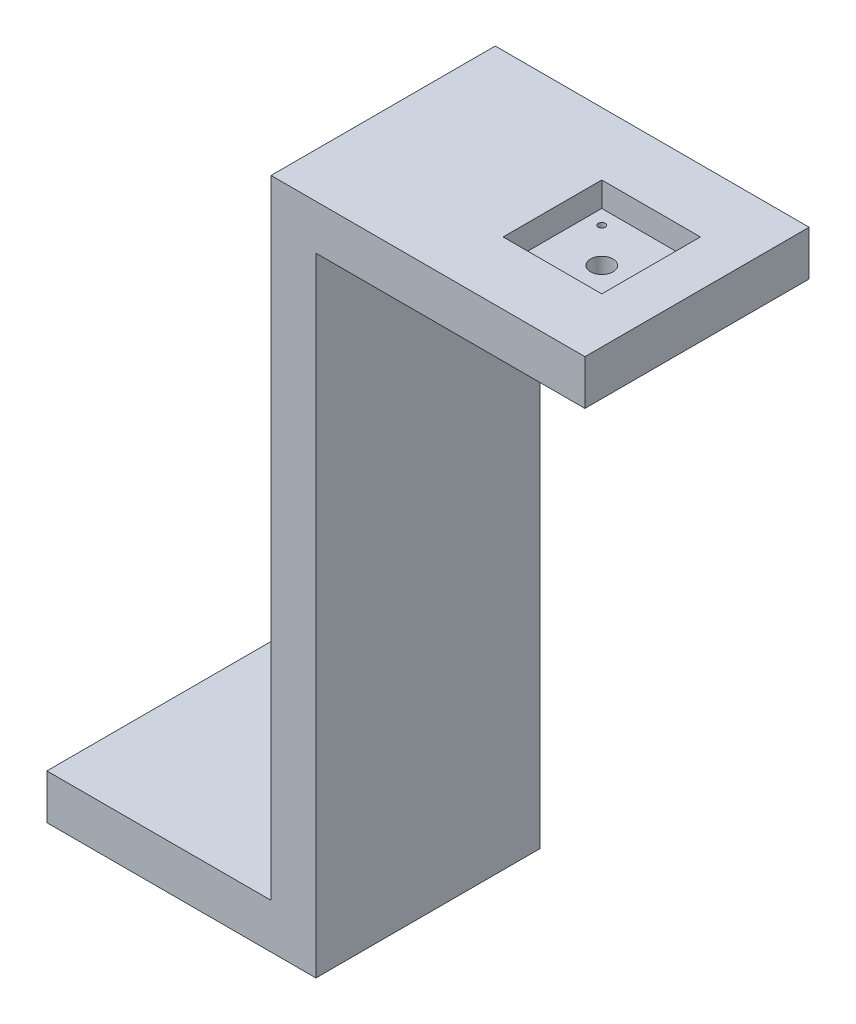
ISO-10303-21;
HEADER;
FILE_DESCRIPTION(('STEP AP214'),'2;1');
FILE_NAME('part.step','',(''),(''),'','','');
FILE_SCHEMA(('AUTOMOTIVE_DESIGN { 1 0 10303 214 1 1 1 1 }'));
ENDSEC;
DATA;
#1=APPLICATION_CONTEXT('core data for automotive mechanical design processes');
#2=APPLICATION_PROTOCOL_DEFINITION('international standard','automotive_design',2000,#1);
#3=PRODUCT_CONTEXT('',#1,'mechanical');
#4=PRODUCT('Part','Part','',(#3));
#5=PRODUCT_RELATED_PRODUCT_CATEGORY('part','',(#4));
#6=PRODUCT_DEFINITION_FORMATION('','',#4);
#7=PRODUCT_DEFINITION_CONTEXT('part definition',#1,'design');
#8=PRODUCT_DEFINITION('design','',#6,#7);
#9=PRODUCT_DEFINITION_SHAPE('','',#8);
#10=(LENGTH_UNIT() NAMED_UNIT(*) SI_UNIT(.MILLI.,.METRE.));
#11=(NAMED_UNIT(*) PLANE_ANGLE_UNIT() SI_UNIT($,.RADIAN.));
#12=(NAMED_UNIT(*) SI_UNIT($,.STERADIAN.) SOLID_ANGLE_UNIT());
#13=UNCERTAINTY_MEASURE_WITH_UNIT(LENGTH_MEASURE(1.E-05),#10,'distance_accuracy_value','');
#14=(GEOMETRIC_REPRESENTATION_CONTEXT(3) GLOBAL_UNCERTAINTY_ASSIGNED_CONTEXT((#13)) GLOBAL_UNIT_ASSIGNED_CONTEXT((#10,
#11,#12)) REPRESENTATION_CONTEXT('',''));
#15=CARTESIAN_POINT('',(0.,0.,0.));
#16=DIRECTION('',(0.,0.,1.));
#17=DIRECTION('',(1.,0.,0.));
#18=AXIS2_PLACEMENT_3D('',#15,#16,#17);
#19=CARTESIAN_POINT('',(77.5,200.,50.));
#20=DIRECTION('',(0.,1.,0.));
#21=DIRECTION('',(0.,0.,1.));
#22=AXIS2_PLACEMENT_3D('',#19,#20,#21);
#23=CYLINDRICAL_SURFACE('',#22,4.99999999999999);
#24=CARTESIAN_POINT('',(77.5,280.,50.));
#25=DIRECTION('',(0.,1.,0.));
#26=DIRECTION('',(0.,0.,1.));
#27=AXIS2_PLACEMENT_3D('',#24,#25,#26);
#28=CIRCLE('',#27,4.99999999999999);
#29=CARTESIAN_POINT('',(77.5,280.,55.));
#30=VERTEX_POINT('',#29);
#31=EDGE_CURVE('E159',#30,#30,#28,.T.);
#32=ORIENTED_EDGE('',*,*,#31,.F.);
#33=EDGE_LOOP('',(#32));
#34=FACE_BOUND('',#33,.T.);
#35=CARTESIAN_POINT('',(77.5,289.,50.));
#36=DIRECTION('',(0.,1.,0.));
#37=DIRECTION('',(0.,0.,1.));
#38=AXIS2_PLACEMENT_3D('',#35,#36,#37);
#39=CIRCLE('',#38,4.99999999999999);
#40=CARTESIAN_POINT('',(77.5,289.,55.));
#41=VERTEX_POINT('',#40);
#42=EDGE_CURVE('E43',#41,#41,#39,.F.);
#43=ORIENTED_EDGE('',*,*,#42,.F.);
#44=EDGE_LOOP('',(#43));
#45=FACE_BOUND('',#44,.T.);
#46=ADVANCED_FACE('F39',(#34,#45),#23,.F.);
#47=CARTESIAN_POINT('',(-120.,0.,100.));
#48=DIRECTION('',(0.,1.,0.));
#49=DIRECTION('',(0.,0.,1.));
#50=AXIS2_PLACEMENT_3D('',#47,#48,#49);
#51=PLANE('',#50);
#52=DIRECTION('',(1.,0.,0.));
#53=VECTOR('',#52,1.);
#54=CARTESIAN_POINT('',(-120.,0.,0.));
#55=LINE('',#54,#53);
#56=CARTESIAN_POINT('',(-120.,0.,0.));
#57=VERTEX_POINT('',#56);
#58=CARTESIAN_POINT('',(0.,0.,0.));
#59=VERTEX_POINT('',#58);
#60=EDGE_CURVE('E154',#57,#59,#55,.T.);
#61=ORIENTED_EDGE('',*,*,#60,.T.);
#62=DIRECTION('',(0.,0.,-1.));
#63=VECTOR('',#62,1.);
#64=CARTESIAN_POINT('',(0.,0.,100.));
#65=LINE('',#64,#63);
#66=CARTESIAN_POINT('',(0.,0.,100.));
#67=VERTEX_POINT('',#66);
#68=EDGE_CURVE('E11',#67,#59,#65,.T.);
#69=ORIENTED_EDGE('',*,*,#68,.F.);
#70=DIRECTION('',(1.,0.,0.));
#71=VECTOR('',#70,1.);
#72=CARTESIAN_POINT('',(-120.,0.,100.));
#73=LINE('',#72,#71);
#74=CARTESIAN_POINT('',(-120.,0.,100.));
#75=VERTEX_POINT('',#74);
#76=EDGE_CURVE('E178',#75,#67,#73,.T.);
#77=ORIENTED_EDGE('',*,*,#76,.F.);
#78=DIRECTION('',(0.,0.,-1.));
#79=VECTOR('',#78,1.);
#80=CARTESIAN_POINT('',(-120.,0.,100.));
#81=LINE('',#80,#79);
#82=EDGE_CURVE('E150',#75,#57,#81,.T.);
#83=ORIENTED_EDGE('',*,*,#82,.T.);
#84=EDGE_LOOP('',(#61,#69,#77,#83));
#85=FACE_BOUND('',#84,.T.);
#86=ADVANCED_FACE('F41',(#85),#51,.F.);
#87=CARTESIAN_POINT('',(0.,0.,100.));
#88=DIRECTION('',(-1.,0.,0.));
#89=DIRECTION('',(0.,0.,1.));
#90=AXIS2_PLACEMENT_3D('',#87,#88,#89);
#91=PLANE('',#90);
#92=DIRECTION('',(0.,1.,0.));
#93=VECTOR('',#92,1.);
#94=CARTESIAN_POINT('',(0.,0.,0.));
#95=LINE('',#94,#93);
#96=CARTESIAN_POINT('',(0.,280.,0.));
#97=VERTEX_POINT('',#96);
#98=EDGE_CURVE('E158',#59,#97,#95,.T.);
#99=ORIENTED_EDGE('',*,*,#98,.T.);
#100=DIRECTION('',(0.,0.,-1.));
#101=VECTOR('',#100,1.);
#102=CARTESIAN_POINT('',(0.,280.,100.));
#103=LINE('',#102,#101);
#104=CARTESIAN_POINT('',(0.,280.,100.));
#105=VERTEX_POINT('',#104);
#106=EDGE_CURVE('E49',#105,#97,#103,.T.);
#107=ORIENTED_EDGE('',*,*,#106,.F.);
#108=DIRECTION('',(0.,1.,0.));
#109=VECTOR('',#108,1.);
#110=CARTESIAN_POINT('',(0.,0.,100.));
#111=LINE('',#110,#109);
#112=EDGE_CURVE('E106',#67,#105,#111,.T.);
#113=ORIENTED_EDGE('',*,*,#112,.F.);
#114=ORIENTED_EDGE('',*,*,#68,.T.);
#115=EDGE_LOOP('',(#99,#107,#113,#114));
#116=FACE_BOUND('',#115,.T.);
#117=ADVANCED_FACE('F327',(#116),#91,.F.);
#118=CARTESIAN_POINT('',(0.,280.,100.));
#119=DIRECTION('',(0.,1.,0.));
#120=DIRECTION('',(0.,0.,1.));
#121=AXIS2_PLACEMENT_3D('',#118,#119,#120);
#122=PLANE('',#121);
#123=CARTESIAN_POINT('',(62.,280.,65.5));
#124=DIRECTION('',(0.,1.,0.));
#125=DIRECTION('',(0.,0.,1.));
#126=AXIS2_PLACEMENT_3D('',#123,#124,#125);
#127=CIRCLE('',#126,1.55000000000001);
#128=CARTESIAN_POINT('',(62.,280.,67.05));
#129=VERTEX_POINT('',#128);
#130=EDGE_CURVE('E256',#129,#129,#127,.T.);
#131=ORIENTED_EDGE('',*,*,#130,.T.);
#132=EDGE_LOOP('',(#131));
#133=FACE_BOUND('',#132,.T.);
#134=CARTESIAN_POINT('',(62.,280.,34.5));
#135=DIRECTION('',(0.,1.,0.));
#136=DIRECTION('',(0.,0.,1.));
#137=AXIS2_PLACEMENT_3D('',#134,#135,#136);
#138=CIRCLE('',#137,1.55);
#139=CARTESIAN_POINT('',(62.,280.,36.05));
#140=VERTEX_POINT('',#139);
#141=EDGE_CURVE('E274',#140,#140,#138,.T.);
#142=ORIENTED_EDGE('',*,*,#141,.T.);
#143=EDGE_LOOP('',(#142));
#144=FACE_BOUND('',#143,.T.);
#145=CARTESIAN_POINT('',(93.,280.,34.5));
#146=DIRECTION('',(0.,1.,0.));
#147=DIRECTION('',(0.,0.,1.));
#148=AXIS2_PLACEMENT_3D('',#145,#146,#147);
#149=CIRCLE('',#148,1.54999999999999);
#150=CARTESIAN_POINT('',(93.,280.,36.05));
#151=VERTEX_POINT('',#150);
#152=EDGE_CURVE('E278',#151,#151,#149,.T.);
#153=ORIENTED_EDGE('',*,*,#152,.T.);
#154=EDGE_LOOP('',(#153));
#155=FACE_BOUND('',#154,.T.);
#156=CARTESIAN_POINT('',(93.,280.,65.5));
#157=DIRECTION('',(0.,1.,0.));
#158=DIRECTION('',(0.,0.,1.));
#159=AXIS2_PLACEMENT_3D('',#156,#157,#158);
#160=CIRCLE('',#159,1.54999999999999);
#161=CARTESIAN_POINT('',(93.,280.,67.05));
#162=VERTEX_POINT('',#161);
#163=EDGE_CURVE('E282',#162,#162,#160,.T.);
#164=ORIENTED_EDGE('',*,*,#163,.T.);
#165=EDGE_LOOP('',(#164));
#166=FACE_BOUND('',#165,.T.);
#167=ORIENTED_EDGE('',*,*,#31,.T.);
#168=EDGE_LOOP('',(#167));
#169=FACE_BOUND('',#168,.T.);
#170=DIRECTION('',(1.,0.,0.));
#171=VECTOR('',#170,1.);
#172=CARTESIAN_POINT('',(0.,280.,0.));
#173=LINE('',#172,#171);
#174=CARTESIAN_POINT('',(120.,280.,0.));
#175=VERTEX_POINT('',#174);
#176=EDGE_CURVE('E162',#97,#175,#173,.T.);
#177=ORIENTED_EDGE('',*,*,#176,.T.);
#178=DIRECTION('',(0.,0.,-1.));
#179=VECTOR('',#178,1.);
#180=CARTESIAN_POINT('',(120.,280.,100.));
#181=LINE('',#180,#179);
#182=CARTESIAN_POINT('',(120.,280.,100.));
#183=VERTEX_POINT('',#182);
#184=EDGE_CURVE('E189',#183,#175,#181,.T.);
#185=ORIENTED_EDGE('',*,*,#184,.F.);
#186=DIRECTION('',(1.,0.,0.));
#187=VECTOR('',#186,1.);
#188=CARTESIAN_POINT('',(0.,280.,100.));
#189=LINE('',#188,#187);
#190=EDGE_CURVE('E200',#105,#183,#189,.T.);
#191=ORIENTED_EDGE('',*,*,#190,.F.);
#192=ORIENTED_EDGE('',*,*,#106,.T.);
#193=EDGE_LOOP('',(#177,#185,#191,#192));
#194=FACE_BOUND('',#193,.T.);
#195=ADVANCED_FACE('F198',(#133,#144,#155,#166,#169,#194),#122,.F.);
#196=CARTESIAN_POINT('',(120.,280.,100.));
#197=DIRECTION('',(-1.,0.,0.));
#198=DIRECTION('',(0.,0.,1.));
#199=AXIS2_PLACEMENT_3D('',#196,#197,#198);
#200=PLANE('',#199);
#201=DIRECTION('',(0.,1.,0.));
#202=VECTOR('',#201,1.);
#203=CARTESIAN_POINT('',(120.,280.,0.));
#204=LINE('',#203,#202);
#205=CARTESIAN_POINT('',(120.,300.,0.));
#206=VERTEX_POINT('',#205);
#207=EDGE_CURVE('E165',#175,#206,#204,.T.);
#208=ORIENTED_EDGE('',*,*,#207,.T.);
#209=DIRECTION('',(0.,0.,-1.));
#210=VECTOR('',#209,1.);
#211=CARTESIAN_POINT('',(120.,300.,100.));
#212=LINE('',#211,#210);
#213=CARTESIAN_POINT('',(120.,300.,100.));
#214=VERTEX_POINT('',#213);
#215=EDGE_CURVE('E185',#214,#206,#212,.T.);
#216=ORIENTED_EDGE('',*,*,#215,.F.);
#217=DIRECTION('',(0.,1.,0.));
#218=VECTOR('',#217,1.);
#219=CARTESIAN_POINT('',(120.,280.,100.));
#220=LINE('',#219,#218);
#221=EDGE_CURVE('E213',#183,#214,#220,.T.);
#222=ORIENTED_EDGE('',*,*,#221,.F.);
#223=ORIENTED_EDGE('',*,*,#184,.T.);
#224=EDGE_LOOP('',(#208,#216,#222,#223));
#225=FACE_BOUND('',#224,.T.);
#226=ADVANCED_FACE('F208',(#225),#200,.F.);
#227=CARTESIAN_POINT('',(120.,300.,100.));
#228=DIRECTION('',(0.,-1.,0.));
#229=DIRECTION('',(0.,0.,-1.));
#230=AXIS2_PLACEMENT_3D('',#227,#228,#229);
#231=PLANE('',#230);
#232=DIRECTION('',(-1.,0.,0.));
#233=VECTOR('',#232,1.);
#234=CARTESIAN_POINT('',(55.5,300.,28.));
#235=LINE('',#234,#233);
#236=CARTESIAN_POINT('',(99.5,300.,28.));
#237=VERTEX_POINT('',#236);
#238=CARTESIAN_POINT('',(55.5,300.,28.));
#239=VERTEX_POINT('',#238);
#240=EDGE_CURVE('E250',#237,#239,#235,.T.);
#241=ORIENTED_EDGE('',*,*,#240,.F.);
#242=DIRECTION('',(0.,0.,-1.));
#243=VECTOR('',#242,1.);
#244=CARTESIAN_POINT('',(99.5,300.,28.));
#245=LINE('',#244,#243);
#246=CARTESIAN_POINT('',(99.5,300.,72.));
#247=VERTEX_POINT('',#246);
#248=EDGE_CURVE('E56',#247,#237,#245,.T.);
#249=ORIENTED_EDGE('',*,*,#248,.F.);
#250=DIRECTION('',(1.,0.,0.));
#251=VECTOR('',#250,1.);
#252=CARTESIAN_POINT('',(55.5,300.,72.));
#253=LINE('',#252,#251);
#254=CARTESIAN_POINT('',(55.5,300.,72.));
#255=VERTEX_POINT('',#254);
#256=EDGE_CURVE('E241',#255,#247,#253,.T.);
#257=ORIENTED_EDGE('',*,*,#256,.F.);
#258=DIRECTION('',(0.,0.,1.));
#259=VECTOR('',#258,1.);
#260=CARTESIAN_POINT('',(55.5,300.,28.));
#261=LINE('',#260,#259);
#262=EDGE_CURVE('E246',#239,#255,#261,.T.);
#263=ORIENTED_EDGE('',*,*,#262,.F.);
#264=EDGE_LOOP('',(#241,#249,#257,#263));
#265=FACE_BOUND('',#264,.T.);
#266=DIRECTION('',(-1.,0.,0.));
#267=VECTOR('',#266,1.);
#268=CARTESIAN_POINT('',(120.,300.,0.));
#269=LINE('',#268,#267);
#270=CARTESIAN_POINT('',(-20.,300.,0.));
#271=VERTEX_POINT('',#270);
#272=EDGE_CURVE('E168',#206,#271,#269,.T.);
#273=ORIENTED_EDGE('',*,*,#272,.T.);
#274=DIRECTION('',(0.,0.,-1.));
#275=VECTOR('',#274,1.);
#276=CARTESIAN_POINT('',(-20.,300.,100.));
#277=LINE('',#276,#275);
#278=CARTESIAN_POINT('',(-20.,300.,100.));
#279=VERTEX_POINT('',#278);
#280=EDGE_CURVE('E143',#279,#271,#277,.T.);
#281=ORIENTED_EDGE('',*,*,#280,.F.);
#282=DIRECTION('',(-1.,0.,0.));
#283=VECTOR('',#282,1.);
#284=CARTESIAN_POINT('',(120.,300.,100.));
#285=LINE('',#284,#283);
#286=EDGE_CURVE('E129',#214,#279,#285,.T.);
#287=ORIENTED_EDGE('',*,*,#286,.F.);
#288=ORIENTED_EDGE('',*,*,#215,.T.);
#289=EDGE_LOOP('',(#273,#281,#287,#288));
#290=FACE_BOUND('',#289,.T.);
#291=ADVANCED_FACE('F211',(#265,#290),#231,.F.);
#292=CARTESIAN_POINT('',(-20.,300.,100.));
#293=DIRECTION('',(1.,0.,0.));
#294=DIRECTION('',(0.,0.,-1.));
#295=AXIS2_PLACEMENT_3D('',#292,#293,#294);
#296=PLANE('',#295);
#297=DIRECTION('',(0.,-1.,0.));
#298=VECTOR('',#297,1.);
#299=CARTESIAN_POINT('',(-20.,300.,0.));
#300=LINE('',#299,#298);
#301=CARTESIAN_POINT('',(-20.,20.,0.));
#302=VERTEX_POINT('',#301);
#303=EDGE_CURVE('E139',#271,#302,#300,.T.);
#304=ORIENTED_EDGE('',*,*,#303,.T.);
#305=DIRECTION('',(0.,0.,-1.));
#306=VECTOR('',#305,1.);
#307=CARTESIAN_POINT('',(-20.,20.,100.));
#308=LINE('',#307,#306);
#309=CARTESIAN_POINT('',(-20.,20.,100.));
#310=VERTEX_POINT('',#309);
#311=EDGE_CURVE('E136',#310,#302,#308,.T.);
#312=ORIENTED_EDGE('',*,*,#311,.F.);
#313=DIRECTION('',(0.,-1.,0.));
#314=VECTOR('',#313,1.);
#315=CARTESIAN_POINT('',(-20.,300.,100.));
#316=LINE('',#315,#314);
#317=EDGE_CURVE('E122',#279,#310,#316,.T.);
#318=ORIENTED_EDGE('',*,*,#317,.F.);
#319=ORIENTED_EDGE('',*,*,#280,.T.);
#320=EDGE_LOOP('',(#304,#312,#318,#319));
#321=FACE_BOUND('',#320,.T.);
#322=ADVANCED_FACE('F137',(#321),#296,.F.);
#323=CARTESIAN_POINT('',(-20.,20.,100.));
#324=DIRECTION('',(0.,-1.,0.));
#325=DIRECTION('',(0.,0.,-1.));
#326=AXIS2_PLACEMENT_3D('',#323,#324,#325);
#327=PLANE('',#326);
#328=DIRECTION('',(-1.,0.,0.));
#329=VECTOR('',#328,1.);
#330=CARTESIAN_POINT('',(-20.,20.,0.));
#331=LINE('',#330,#329);
#332=CARTESIAN_POINT('',(-120.,20.,0.));
#333=VERTEX_POINT('',#332);
#334=EDGE_CURVE('E173',#302,#333,#331,.T.);
#335=ORIENTED_EDGE('',*,*,#334,.T.);
#336=DIRECTION('',(0.,0.,-1.));
#337=VECTOR('',#336,1.);
#338=CARTESIAN_POINT('',(-120.,20.,100.));
#339=LINE('',#338,#337);
#340=CARTESIAN_POINT('',(-120.,20.,100.));
#341=VERTEX_POINT('',#340);
#342=EDGE_CURVE('E144',#341,#333,#339,.T.);
#343=ORIENTED_EDGE('',*,*,#342,.F.);
#344=DIRECTION('',(-1.,0.,0.));
#345=VECTOR('',#344,1.);
#346=CARTESIAN_POINT('',(-20.,20.,100.));
#347=LINE('',#346,#345);
#348=EDGE_CURVE('E126',#310,#341,#347,.T.);
#349=ORIENTED_EDGE('',*,*,#348,.F.);
#350=ORIENTED_EDGE('',*,*,#311,.T.);
#351=EDGE_LOOP('',(#335,#343,#349,#350));
#352=FACE_BOUND('',#351,.T.);
#353=ADVANCED_FACE('F146',(#352),#327,.F.);
#354=CARTESIAN_POINT('',(-120.,20.,100.));
#355=DIRECTION('',(1.,0.,0.));
#356=DIRECTION('',(0.,0.,-1.));
#357=AXIS2_PLACEMENT_3D('',#354,#355,#356);
#358=PLANE('',#357);
#359=DIRECTION('',(0.,-1.,0.));
#360=VECTOR('',#359,1.);
#361=CARTESIAN_POINT('',(-120.,20.,0.));
#362=LINE('',#361,#360);
#363=EDGE_CURVE('E98',#333,#57,#362,.T.);
#364=ORIENTED_EDGE('',*,*,#363,.T.);
#365=ORIENTED_EDGE('',*,*,#82,.F.);
#366=DIRECTION('',(0.,-1.,0.));
#367=VECTOR('',#366,1.);
#368=CARTESIAN_POINT('',(-120.,20.,100.));
#369=LINE('',#368,#367);
#370=EDGE_CURVE('E65',#341,#75,#369,.T.);
#371=ORIENTED_EDGE('',*,*,#370,.F.);
#372=ORIENTED_EDGE('',*,*,#342,.T.);
#373=EDGE_LOOP('',(#364,#365,#371,#372));
#374=FACE_BOUND('',#373,.T.);
#375=ADVANCED_FACE('F335',(#374),#358,.F.);
#376=CARTESIAN_POINT('',(0.,0.,100.));
#377=DIRECTION('',(0.,0.,1.));
#378=DIRECTION('',(1.,0.,0.));
#379=AXIS2_PLACEMENT_3D('',#376,#377,#378);
#380=PLANE('',#379);
#381=ORIENTED_EDGE('',*,*,#76,.T.);
#382=ORIENTED_EDGE('',*,*,#112,.T.);
#383=ORIENTED_EDGE('',*,*,#190,.T.);
#384=ORIENTED_EDGE('',*,*,#221,.T.);
#385=ORIENTED_EDGE('',*,*,#286,.T.);
#386=ORIENTED_EDGE('',*,*,#317,.T.);
#387=ORIENTED_EDGE('',*,*,#348,.T.);
#388=ORIENTED_EDGE('',*,*,#370,.T.);
#389=EDGE_LOOP('',(#381,#382,#383,#384,#385,#386,#387,#388));
#390=FACE_BOUND('',#389,.T.);
#391=ADVANCED_FACE('F124',(#390),#380,.T.);
#392=CARTESIAN_POINT('',(0.,0.,0.));
#393=DIRECTION('',(0.,0.,1.));
#394=DIRECTION('',(1.,0.,0.));
#395=AXIS2_PLACEMENT_3D('',#392,#393,#394);
#396=PLANE('',#395);
#397=ORIENTED_EDGE('',*,*,#60,.F.);
#398=ORIENTED_EDGE('',*,*,#363,.F.);
#399=ORIENTED_EDGE('',*,*,#334,.F.);
#400=ORIENTED_EDGE('',*,*,#303,.F.);
#401=ORIENTED_EDGE('',*,*,#272,.F.);
#402=ORIENTED_EDGE('',*,*,#207,.F.);
#403=ORIENTED_EDGE('',*,*,#176,.F.);
#404=ORIENTED_EDGE('',*,*,#98,.F.);
#405=EDGE_LOOP('',(#397,#398,#399,#400,#401,#402,#403,#404));
#406=FACE_BOUND('',#405,.T.);
#407=ADVANCED_FACE('F204',(#406),#396,.F.);
#408=CARTESIAN_POINT('',(0.,289.,0.));
#409=DIRECTION('',(0.,1.,0.));
#410=DIRECTION('',(0.,0.,1.));
#411=AXIS2_PLACEMENT_3D('',#408,#409,#410);
#412=PLANE('',#411);
#413=CARTESIAN_POINT('',(62.,289.,65.5));
#414=DIRECTION('',(0.,1.,0.));
#415=DIRECTION('',(0.,0.,1.));
#416=AXIS2_PLACEMENT_3D('',#413,#414,#415);
#417=CIRCLE('',#416,1.55000000000001);
#418=CARTESIAN_POINT('',(62.,289.,67.05));
#419=VERTEX_POINT('',#418);
#420=EDGE_CURVE('E291',#419,#419,#417,.T.);
#421=ORIENTED_EDGE('',*,*,#420,.F.);
#422=EDGE_LOOP('',(#421));
#423=FACE_BOUND('',#422,.T.);
#424=CARTESIAN_POINT('',(62.,289.,34.5));
#425=DIRECTION('',(0.,1.,0.));
#426=DIRECTION('',(0.,0.,1.));
#427=AXIS2_PLACEMENT_3D('',#424,#425,#426);
#428=CIRCLE('',#427,1.55);
#429=CARTESIAN_POINT('',(62.,289.,36.05));
#430=VERTEX_POINT('',#429);
#431=EDGE_CURVE('E295',#430,#430,#428,.T.);
#432=ORIENTED_EDGE('',*,*,#431,.F.);
#433=EDGE_LOOP('',(#432));
#434=FACE_BOUND('',#433,.T.);
#435=CARTESIAN_POINT('',(93.,289.,34.5));
#436=DIRECTION('',(0.,1.,0.));
#437=DIRECTION('',(0.,0.,1.));
#438=AXIS2_PLACEMENT_3D('',#435,#436,#437);
#439=CIRCLE('',#438,1.54999999999999);
#440=CARTESIAN_POINT('',(93.,289.,36.05));
#441=VERTEX_POINT('',#440);
#442=EDGE_CURVE('E290',#441,#441,#439,.T.);
#443=ORIENTED_EDGE('',*,*,#442,.F.);
#444=EDGE_LOOP('',(#443));
#445=FACE_BOUND('',#444,.T.);
#446=CARTESIAN_POINT('',(93.,289.,65.5));
#447=DIRECTION('',(0.,1.,0.));
#448=DIRECTION('',(0.,0.,1.));
#449=AXIS2_PLACEMENT_3D('',#446,#447,#448);
#450=CIRCLE('',#449,1.54999999999999);
#451=CARTESIAN_POINT('',(93.,289.,67.05));
#452=VERTEX_POINT('',#451);
#453=EDGE_CURVE('E286',#452,#452,#450,.T.);
#454=ORIENTED_EDGE('',*,*,#453,.F.);
#455=EDGE_LOOP('',(#454));
#456=FACE_BOUND('',#455,.T.);
#457=DIRECTION('',(0.,0.,-1.));
#458=VECTOR('',#457,1.);
#459=CARTESIAN_POINT('',(99.5,289.,28.));
#460=LINE('',#459,#458);
#461=CARTESIAN_POINT('',(99.5,289.,72.));
#462=VERTEX_POINT('',#461);
#463=CARTESIAN_POINT('',(99.5,289.,28.));
#464=VERTEX_POINT('',#463);
#465=EDGE_CURVE('E245',#462,#464,#460,.T.);
#466=ORIENTED_EDGE('',*,*,#465,.T.);
#467=DIRECTION('',(-1.,0.,0.));
#468=VECTOR('',#467,1.);
#469=CARTESIAN_POINT('',(55.5,289.,28.));
#470=LINE('',#469,#468);
#471=CARTESIAN_POINT('',(55.5,289.,28.));
#472=VERTEX_POINT('',#471);
#473=EDGE_CURVE('E264',#464,#472,#470,.T.);
#474=ORIENTED_EDGE('',*,*,#473,.T.);
#475=DIRECTION('',(0.,0.,1.));
#476=VECTOR('',#475,1.);
#477=CARTESIAN_POINT('',(55.5,289.,28.));
#478=LINE('',#477,#476);
#479=CARTESIAN_POINT('',(55.5,289.,72.));
#480=VERTEX_POINT('',#479);
#481=EDGE_CURVE('E260',#472,#480,#478,.T.);
#482=ORIENTED_EDGE('',*,*,#481,.T.);
#483=DIRECTION('',(1.,0.,0.));
#484=VECTOR('',#483,1.);
#485=CARTESIAN_POINT('',(55.5,289.,72.));
#486=LINE('',#485,#484);
#487=EDGE_CURVE('E230',#480,#462,#486,.T.);
#488=ORIENTED_EDGE('',*,*,#487,.T.);
#489=EDGE_LOOP('',(#466,#474,#482,#488));
#490=FACE_BOUND('',#489,.T.);
#491=ORIENTED_EDGE('',*,*,#42,.T.);
#492=EDGE_LOOP('',(#491));
#493=FACE_BOUND('',#492,.T.);
#494=ADVANCED_FACE('F306',(#423,#434,#445,#456,#490,#493),#412,.T.);
#495=CARTESIAN_POINT('',(99.5,289.,28.));
#496=DIRECTION('',(1.,0.,0.));
#497=DIRECTION('',(0.,0.,-1.));
#498=AXIS2_PLACEMENT_3D('',#495,#496,#497);
#499=PLANE('',#498);
#500=ORIENTED_EDGE('',*,*,#248,.T.);
#501=DIRECTION('',(0.,1.,0.));
#502=VECTOR('',#501,1.);
#503=CARTESIAN_POINT('',(99.5,289.,28.));
#504=LINE('',#503,#502);
#505=EDGE_CURVE('E226',#464,#237,#504,.T.);
#506=ORIENTED_EDGE('',*,*,#505,.F.);
#507=ORIENTED_EDGE('',*,*,#465,.F.);
#508=DIRECTION('',(0.,1.,0.));
#509=VECTOR('',#508,1.);
#510=CARTESIAN_POINT('',(99.5,289.,72.));
#511=LINE('',#510,#509);
#512=EDGE_CURVE('E238',#462,#247,#511,.T.);
#513=ORIENTED_EDGE('',*,*,#512,.T.);
#514=EDGE_LOOP('',(#500,#506,#507,#513));
#515=FACE_BOUND('',#514,.T.);
#516=ADVANCED_FACE('F309',(#515),#499,.F.);
#517=CARTESIAN_POINT('',(55.5,289.,72.));
#518=DIRECTION('',(0.,0.,1.));
#519=DIRECTION('',(1.,0.,0.));
#520=AXIS2_PLACEMENT_3D('',#517,#518,#519);
#521=PLANE('',#520);
#522=ORIENTED_EDGE('',*,*,#256,.T.);
#523=ORIENTED_EDGE('',*,*,#512,.F.);
#524=ORIENTED_EDGE('',*,*,#487,.F.);
#525=DIRECTION('',(0.,1.,0.));
#526=VECTOR('',#525,1.);
#527=CARTESIAN_POINT('',(55.5,289.,72.));
#528=LINE('',#527,#526);
#529=EDGE_CURVE('E234',#480,#255,#528,.T.);
#530=ORIENTED_EDGE('',*,*,#529,.T.);
#531=EDGE_LOOP('',(#522,#523,#524,#530));
#532=FACE_BOUND('',#531,.T.);
#533=ADVANCED_FACE('F402',(#532),#521,.F.);
#534=CARTESIAN_POINT('',(55.5,289.,28.));
#535=DIRECTION('',(-1.,0.,0.));
#536=DIRECTION('',(0.,0.,1.));
#537=AXIS2_PLACEMENT_3D('',#534,#535,#536);
#538=PLANE('',#537);
#539=ORIENTED_EDGE('',*,*,#262,.T.);
#540=ORIENTED_EDGE('',*,*,#529,.F.);
#541=ORIENTED_EDGE('',*,*,#481,.F.);
#542=DIRECTION('',(0.,1.,0.));
#543=VECTOR('',#542,1.);
#544=CARTESIAN_POINT('',(55.5,289.,28.));
#545=LINE('',#544,#543);
#546=EDGE_CURVE('E229',#472,#239,#545,.T.);
#547=ORIENTED_EDGE('',*,*,#546,.T.);
#548=EDGE_LOOP('',(#539,#540,#541,#547));
#549=FACE_BOUND('',#548,.T.);
#550=ADVANCED_FACE('F408',(#549),#538,.F.);
#551=CARTESIAN_POINT('',(55.5,289.,28.));
#552=DIRECTION('',(0.,0.,-1.));
#553=DIRECTION('',(-1.,0.,0.));
#554=AXIS2_PLACEMENT_3D('',#551,#552,#553);
#555=PLANE('',#554);
#556=ORIENTED_EDGE('',*,*,#240,.T.);
#557=ORIENTED_EDGE('',*,*,#546,.F.);
#558=ORIENTED_EDGE('',*,*,#473,.F.);
#559=ORIENTED_EDGE('',*,*,#505,.T.);
#560=EDGE_LOOP('',(#556,#557,#558,#559));
#561=FACE_BOUND('',#560,.T.);
#562=ADVANCED_FACE('F416',(#561),#555,.F.);
#563=CARTESIAN_POINT('',(93.,278.,65.5));
#564=DIRECTION('',(0.,1.,0.));
#565=DIRECTION('',(0.,0.,1.));
#566=AXIS2_PLACEMENT_3D('',#563,#564,#565);
#567=CYLINDRICAL_SURFACE('',#566,1.54999999999999);
#568=ORIENTED_EDGE('',*,*,#453,.T.);
#569=EDGE_LOOP('',(#568));
#570=FACE_BOUND('',#569,.T.);
#571=ORIENTED_EDGE('',*,*,#163,.F.);
#572=EDGE_LOOP('',(#571));
#573=FACE_BOUND('',#572,.T.);
#574=ADVANCED_FACE('F423',(#570,#573),#567,.F.);
#575=CARTESIAN_POINT('',(93.,278.,34.5));
#576=DIRECTION('',(0.,1.,0.));
#577=DIRECTION('',(0.,0.,1.));
#578=AXIS2_PLACEMENT_3D('',#575,#576,#577);
#579=CYLINDRICAL_SURFACE('',#578,1.54999999999999);
#580=ORIENTED_EDGE('',*,*,#442,.T.);
#581=EDGE_LOOP('',(#580));
#582=FACE_BOUND('',#581,.T.);
#583=ORIENTED_EDGE('',*,*,#152,.F.);
#584=EDGE_LOOP('',(#583));
#585=FACE_BOUND('',#584,.T.);
#586=ADVANCED_FACE('F303',(#582,#585),#579,.F.);
#587=CARTESIAN_POINT('',(62.,278.,34.5));
#588=DIRECTION('',(0.,1.,0.));
#589=DIRECTION('',(0.,0.,1.));
#590=AXIS2_PLACEMENT_3D('',#587,#588,#589);
#591=CYLINDRICAL_SURFACE('',#590,1.55);
#592=ORIENTED_EDGE('',*,*,#431,.T.);
#593=EDGE_LOOP('',(#592));
#594=FACE_BOUND('',#593,.T.);
#595=ORIENTED_EDGE('',*,*,#141,.F.);
#596=EDGE_LOOP('',(#595));
#597=FACE_BOUND('',#596,.T.);
#598=ADVANCED_FACE('F436',(#594,#597),#591,.F.);
#599=CARTESIAN_POINT('',(62.,278.,65.5));
#600=DIRECTION('',(0.,1.,0.));
#601=DIRECTION('',(0.,0.,1.));
#602=AXIS2_PLACEMENT_3D('',#599,#600,#601);
#603=CYLINDRICAL_SURFACE('',#602,1.55000000000001);
#604=ORIENTED_EDGE('',*,*,#420,.T.);
#605=EDGE_LOOP('',(#604));
#606=FACE_BOUND('',#605,.T.);
#607=ORIENTED_EDGE('',*,*,#130,.F.);
#608=EDGE_LOOP('',(#607));
#609=FACE_BOUND('',#608,.T.);
#610=ADVANCED_FACE('F443',(#606,#609),#603,.F.);
#611=CLOSED_SHELL('',(#46,#86,#117,#195,#226,#291,#322,#353,#375,#391,#407,#494,#516,#533,#550,
#562,#574,#586,#598,#610));
#612=MANIFOLD_SOLID_BREP('B2',#611);
#613=ADVANCED_BREP_SHAPE_REPRESENTATION('',(#18,#612),#14);
#614=SHAPE_DEFINITION_REPRESENTATION(#9,#613);
ENDSEC;
END-ISO-10303-21;
